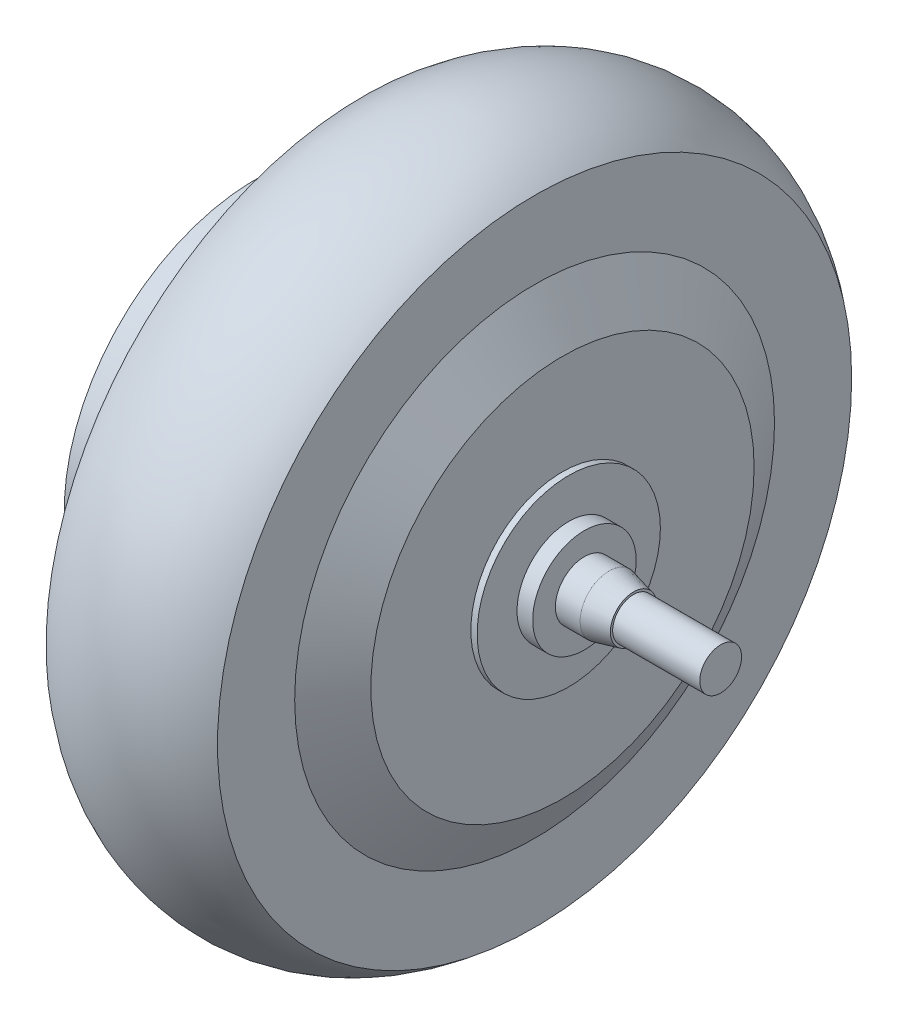
ISO-10303-21;
HEADER;
FILE_DESCRIPTION(('STEP AP214'),'2;1');
FILE_NAME('part.step','',(''),(''),'','','');
FILE_SCHEMA(('AUTOMOTIVE_DESIGN { 1 0 10303 214 1 1 1 1 }'));
ENDSEC;
DATA;
#1=APPLICATION_CONTEXT('core data for automotive mechanical design processes');
#2=APPLICATION_PROTOCOL_DEFINITION('international standard','automotive_design',2000,#1);
#3=PRODUCT_CONTEXT('',#1,'mechanical');
#4=PRODUCT('Part','Part','',(#3));
#5=PRODUCT_RELATED_PRODUCT_CATEGORY('part','',(#4));
#6=PRODUCT_DEFINITION_FORMATION('','',#4);
#7=PRODUCT_DEFINITION_CONTEXT('part definition',#1,'design');
#8=PRODUCT_DEFINITION('design','',#6,#7);
#9=PRODUCT_DEFINITION_SHAPE('','',#8);
#10=(LENGTH_UNIT() NAMED_UNIT(*) SI_UNIT(.MILLI.,.METRE.));
#11=(NAMED_UNIT(*) PLANE_ANGLE_UNIT() SI_UNIT($,.RADIAN.));
#12=(NAMED_UNIT(*) SI_UNIT($,.STERADIAN.) SOLID_ANGLE_UNIT());
#13=UNCERTAINTY_MEASURE_WITH_UNIT(LENGTH_MEASURE(1.E-05),#10,'distance_accuracy_value','');
#14=(GEOMETRIC_REPRESENTATION_CONTEXT(3) GLOBAL_UNCERTAINTY_ASSIGNED_CONTEXT((#13)) GLOBAL_UNIT_ASSIGNED_CONTEXT((#10,
#11,#12)) REPRESENTATION_CONTEXT('',''));
#15=CARTESIAN_POINT('',(0.,0.,0.));
#16=DIRECTION('',(0.,0.,1.));
#17=DIRECTION('',(1.,0.,0.));
#18=AXIS2_PLACEMENT_3D('',#15,#16,#17);
#19=CARTESIAN_POINT('',(-55.4,0.,0.));
#20=DIRECTION('',(-1.,0.,0.));
#21=DIRECTION('',(0.,0.,1.));
#22=AXIS2_PLACEMENT_3D('',#19,#20,#21);
#23=PLANE('',#22);
#24=CARTESIAN_POINT('',(-55.4,22.6274169979696,22.6274169979695));
#25=DIRECTION('',(-1.,0.,0.));
#26=DIRECTION('',(0.,0.,1.));
#27=AXIS2_PLACEMENT_3D('',#24,#25,#26);
#28=CIRCLE('',#27,6.05);
#29=CARTESIAN_POINT('',(-55.4,22.6274169979696,28.6774169979695));
#30=VERTEX_POINT('',#29);
#31=EDGE_CURVE('E107',#30,#30,#28,.T.);
#32=ORIENTED_EDGE('',*,*,#31,.F.);
#33=EDGE_LOOP('',(#32));
#34=FACE_BOUND('',#33,.T.);
#35=CARTESIAN_POINT('',(-55.4,0.,0.));
#36=DIRECTION('',(1.,0.,0.));
#37=DIRECTION('',(0.,0.,-1.));
#38=AXIS2_PLACEMENT_3D('',#35,#36,#37);
#39=CIRCLE('',#38,11.25);
#40=CARTESIAN_POINT('',(-55.4,0.,-11.25));
#41=VERTEX_POINT('',#40);
#42=EDGE_CURVE('E127',#41,#41,#39,.T.);
#43=ORIENTED_EDGE('',*,*,#42,.T.);
#44=EDGE_LOOP('',(#43));
#45=FACE_BOUND('',#44,.T.);
#46=CARTESIAN_POINT('',(-55.4,0.,0.));
#47=DIRECTION('',(1.,0.,0.));
#48=DIRECTION('',(0.,0.,-1.));
#49=AXIS2_PLACEMENT_3D('',#46,#47,#48);
#50=CIRCLE('',#49,55.);
#51=CARTESIAN_POINT('',(-55.4,0.,-55.));
#52=VERTEX_POINT('',#51);
#53=EDGE_CURVE('E130',#52,#52,#50,.T.);
#54=ORIENTED_EDGE('',*,*,#53,.F.);
#55=EDGE_LOOP('',(#54));
#56=FACE_BOUND('',#55,.T.);
#57=DIRECTION('',(0.,1.,0.));
#58=VECTOR('',#57,1.);
#59=CARTESIAN_POINT('',(-55.4,0.,27.9774169979695));
#60=LINE('',#59,#58);
#61=CARTESIAN_POINT('',(-55.4,-34.7225830020304,27.9774169979695));
#62=VERTEX_POINT('',#61);
#63=CARTESIAN_POINT('',(-55.4,-18.0225830020304,27.9774169979695));
#64=VERTEX_POINT('',#63);
#65=EDGE_CURVE('E59',#62,#64,#60,.T.);
#66=ORIENTED_EDGE('',*,*,#65,.F.);
#67=DIRECTION('',(0.,0.,1.));
#68=VECTOR('',#67,1.);
#69=CARTESIAN_POINT('',(-55.4,-34.7225830020304,0.));
#70=LINE('',#69,#68);
#71=CARTESIAN_POINT('',(-55.4,-34.7225830020304,17.2774169979695));
#72=VERTEX_POINT('',#71);
#73=EDGE_CURVE('E106',#72,#62,#70,.T.);
#74=ORIENTED_EDGE('',*,*,#73,.F.);
#75=DIRECTION('',(0.,1.,0.));
#76=VECTOR('',#75,1.);
#77=CARTESIAN_POINT('',(-55.4,0.,17.2774169979695));
#78=LINE('',#77,#76);
#79=CARTESIAN_POINT('',(-55.4,-18.0225830020304,17.2774169979695));
#80=VERTEX_POINT('',#79);
#81=EDGE_CURVE('E103',#72,#80,#78,.T.);
#82=ORIENTED_EDGE('',*,*,#81,.T.);
#83=DIRECTION('',(0.,0.,1.));
#84=VECTOR('',#83,1.);
#85=CARTESIAN_POINT('',(-55.4,-18.0225830020304,0.));
#86=LINE('',#85,#84);
#87=EDGE_CURVE('E64',#80,#64,#86,.T.);
#88=ORIENTED_EDGE('',*,*,#87,.T.);
#89=EDGE_LOOP('',(#66,#74,#82,#88));
#90=FACE_BOUND('',#89,.T.);
#91=ADVANCED_FACE('F44',(#34,#45,#56,#90),#23,.T.);
#92=CARTESIAN_POINT('',(78.,0.,0.));
#93=DIRECTION('',(-1.,0.,0.));
#94=DIRECTION('',(0.,0.,1.));
#95=AXIS2_PLACEMENT_3D('',#92,#93,#94);
#96=PLANE('',#95);
#97=CARTESIAN_POINT('',(78.,0.,0.));
#98=DIRECTION('',(1.,0.,0.));
#99=DIRECTION('',(0.,0.,-1.));
#100=AXIS2_PLACEMENT_3D('',#97,#98,#99);
#101=CIRCLE('',#100,6.00000000000005);
#102=CARTESIAN_POINT('',(78.,0.,-6.00000000000005));
#103=VERTEX_POINT('',#102);
#104=EDGE_CURVE('E11',#103,#103,#101,.T.);
#105=ORIENTED_EDGE('',*,*,#104,.T.);
#106=EDGE_LOOP('',(#105));
#107=FACE_BOUND('',#106,.T.);
#108=ADVANCED_FACE('F46',(#107),#96,.F.);
#109=CARTESIAN_POINT('',(0.,0.,0.));
#110=DIRECTION('',(1.,0.,0.));
#111=DIRECTION('',(0.,0.,-1.));
#112=AXIS2_PLACEMENT_3D('',#109,#110,#111);
#113=CYLINDRICAL_SURFACE('',#112,6.00000000000004);
#114=ORIENTED_EDGE('',*,*,#104,.F.);
#115=EDGE_LOOP('',(#114));
#116=FACE_BOUND('',#115,.T.);
#117=CARTESIAN_POINT('',(53.,0.,0.));
#118=DIRECTION('',(1.,0.,0.));
#119=DIRECTION('',(0.,0.,-1.));
#120=AXIS2_PLACEMENT_3D('',#117,#118,#119);
#121=CIRCLE('',#120,6.00000000000002);
#122=CARTESIAN_POINT('',(53.,0.,-6.00000000000002));
#123=VERTEX_POINT('',#122);
#124=EDGE_CURVE('E52',#123,#123,#121,.T.);
#125=ORIENTED_EDGE('',*,*,#124,.T.);
#126=EDGE_LOOP('',(#125));
#127=FACE_BOUND('',#126,.T.);
#128=ADVANCED_FACE('F174',(#116,#127),#113,.T.);
#129=CARTESIAN_POINT('',(53.,0.,0.));
#130=DIRECTION('',(1.,0.,0.));
#131=DIRECTION('',(0.,0.,-1.));
#132=AXIS2_PLACEMENT_3D('',#129,#130,#131);
#133=PLANE('',#132);
#134=CARTESIAN_POINT('',(53.,0.,0.));
#135=DIRECTION('',(1.,0.,0.));
#136=DIRECTION('',(0.,0.,-1.));
#137=AXIS2_PLACEMENT_3D('',#134,#135,#136);
#138=CIRCLE('',#137,6.65);
#139=CARTESIAN_POINT('',(53.,0.,-6.65));
#140=VERTEX_POINT('',#139);
#141=EDGE_CURVE('E169',#140,#140,#138,.T.);
#142=ORIENTED_EDGE('',*,*,#141,.T.);
#143=EDGE_LOOP('',(#142));
#144=FACE_BOUND('',#143,.T.);
#145=ORIENTED_EDGE('',*,*,#124,.F.);
#146=EDGE_LOOP('',(#145));
#147=FACE_BOUND('',#146,.T.);
#148=ADVANCED_FACE('F176',(#144,#147),#133,.T.);
#149=CARTESIAN_POINT('',(46.,0.,0.));
#150=DIRECTION('',(-1.,0.,0.));
#151=DIRECTION('',(0.,0.,1.));
#152=AXIS2_PLACEMENT_3D('',#149,#150,#151);
#153=CONICAL_SURFACE('',#152,8.35000000000004,0.23824475817875);
#154=ORIENTED_EDGE('',*,*,#141,.F.);
#155=EDGE_LOOP('',(#154));
#156=FACE_BOUND('',#155,.T.);
#157=CARTESIAN_POINT('',(46.,0.,0.));
#158=DIRECTION('',(1.,0.,0.));
#159=DIRECTION('',(0.,0.,-1.));
#160=AXIS2_PLACEMENT_3D('',#157,#158,#159);
#161=CIRCLE('',#160,8.35000000000004);
#162=CARTESIAN_POINT('',(46.,0.,-8.35000000000004));
#163=VERTEX_POINT('',#162);
#164=EDGE_CURVE('E166',#163,#163,#161,.T.);
#165=ORIENTED_EDGE('',*,*,#164,.T.);
#166=EDGE_LOOP('',(#165));
#167=FACE_BOUND('',#166,.T.);
#168=ADVANCED_FACE('F178',(#156,#167),#153,.T.);
#169=CARTESIAN_POINT('',(0.,0.,0.));
#170=DIRECTION('',(1.,0.,0.));
#171=DIRECTION('',(0.,0.,-1.));
#172=AXIS2_PLACEMENT_3D('',#169,#170,#171);
#173=CYLINDRICAL_SURFACE('',#172,8.35000000000003);
#174=ORIENTED_EDGE('',*,*,#164,.F.);
#175=EDGE_LOOP('',(#174));
#176=FACE_BOUND('',#175,.T.);
#177=CARTESIAN_POINT('',(38.9,0.,0.));
#178=DIRECTION('',(1.,0.,0.));
#179=DIRECTION('',(0.,0.,-1.));
#180=AXIS2_PLACEMENT_3D('',#177,#178,#179);
#181=CIRCLE('',#180,8.35000000000002);
#182=CARTESIAN_POINT('',(38.9,0.,-8.35000000000002));
#183=VERTEX_POINT('',#182);
#184=EDGE_CURVE('E163',#183,#183,#181,.T.);
#185=ORIENTED_EDGE('',*,*,#184,.T.);
#186=EDGE_LOOP('',(#185));
#187=FACE_BOUND('',#186,.T.);
#188=ADVANCED_FACE('F185',(#176,#187),#173,.T.);
#189=CARTESIAN_POINT('',(38.9,0.,0.));
#190=DIRECTION('',(-1.,0.,0.));
#191=DIRECTION('',(0.,0.,1.));
#192=AXIS2_PLACEMENT_3D('',#189,#190,#191);
#193=PLANE('',#192);
#194=ORIENTED_EDGE('',*,*,#184,.F.);
#195=EDGE_LOOP('',(#194));
#196=FACE_BOUND('',#195,.T.);
#197=CARTESIAN_POINT('',(38.9,0.,0.));
#198=DIRECTION('',(1.,0.,0.));
#199=DIRECTION('',(0.,0.,-1.));
#200=AXIS2_PLACEMENT_3D('',#197,#198,#199);
#201=CIRCLE('',#200,14.85);
#202=CARTESIAN_POINT('',(38.9,0.,-14.85));
#203=VERTEX_POINT('',#202);
#204=EDGE_CURVE('E160',#203,#203,#201,.T.);
#205=ORIENTED_EDGE('',*,*,#204,.T.);
#206=EDGE_LOOP('',(#205));
#207=FACE_BOUND('',#206,.T.);
#208=ADVANCED_FACE('F241',(#196,#207),#193,.F.);
#209=CARTESIAN_POINT('',(0.,0.,0.));
#210=DIRECTION('',(1.,0.,0.));
#211=DIRECTION('',(0.,0.,-1.));
#212=AXIS2_PLACEMENT_3D('',#209,#210,#211);
#213=CYLINDRICAL_SURFACE('',#212,14.85);
#214=ORIENTED_EDGE('',*,*,#204,.F.);
#215=EDGE_LOOP('',(#214));
#216=FACE_BOUND('',#215,.T.);
#217=CARTESIAN_POINT('',(34.4,0.,0.));
#218=DIRECTION('',(1.,0.,0.));
#219=DIRECTION('',(0.,0.,-1.));
#220=AXIS2_PLACEMENT_3D('',#217,#218,#219);
#221=CIRCLE('',#220,14.85);
#222=CARTESIAN_POINT('',(34.4,0.,-14.85));
#223=VERTEX_POINT('',#222);
#224=EDGE_CURVE('E157',#223,#223,#221,.T.);
#225=ORIENTED_EDGE('',*,*,#224,.T.);
#226=EDGE_LOOP('',(#225));
#227=FACE_BOUND('',#226,.T.);
#228=ADVANCED_FACE('F237',(#216,#227),#213,.T.);
#229=CARTESIAN_POINT('',(34.4,0.,0.));
#230=DIRECTION('',(-1.,0.,0.));
#231=DIRECTION('',(0.,0.,1.));
#232=AXIS2_PLACEMENT_3D('',#229,#230,#231);
#233=PLANE('',#232);
#234=ORIENTED_EDGE('',*,*,#224,.F.);
#235=EDGE_LOOP('',(#234));
#236=FACE_BOUND('',#235,.T.);
#237=CARTESIAN_POINT('',(34.4,0.,0.));
#238=DIRECTION('',(1.,0.,0.));
#239=DIRECTION('',(0.,0.,-1.));
#240=AXIS2_PLACEMENT_3D('',#237,#238,#239);
#241=CIRCLE('',#240,26.3);
#242=CARTESIAN_POINT('',(34.4,0.,-26.3));
#243=VERTEX_POINT('',#242);
#244=EDGE_CURVE('E154',#243,#243,#241,.T.);
#245=ORIENTED_EDGE('',*,*,#244,.T.);
#246=EDGE_LOOP('',(#245));
#247=FACE_BOUND('',#246,.T.);
#248=ADVANCED_FACE('F233',(#236,#247),#233,.F.);
#249=CARTESIAN_POINT('',(0.,0.,0.));
#250=DIRECTION('',(1.,0.,0.));
#251=DIRECTION('',(0.,0.,-1.));
#252=AXIS2_PLACEMENT_3D('',#249,#250,#251);
#253=CYLINDRICAL_SURFACE('',#252,26.3);
#254=ORIENTED_EDGE('',*,*,#244,.F.);
#255=EDGE_LOOP('',(#254));
#256=FACE_BOUND('',#255,.T.);
#257=CARTESIAN_POINT('',(32.6,0.,0.));
#258=DIRECTION('',(1.,0.,0.));
#259=DIRECTION('',(0.,0.,-1.));
#260=AXIS2_PLACEMENT_3D('',#257,#258,#259);
#261=CIRCLE('',#260,26.3);
#262=CARTESIAN_POINT('',(32.6,0.,-26.3));
#263=VERTEX_POINT('',#262);
#264=EDGE_CURVE('E151',#263,#263,#261,.T.);
#265=ORIENTED_EDGE('',*,*,#264,.T.);
#266=EDGE_LOOP('',(#265));
#267=FACE_BOUND('',#266,.T.);
#268=ADVANCED_FACE('F229',(#256,#267),#253,.T.);
#269=CARTESIAN_POINT('',(32.6,0.,0.));
#270=DIRECTION('',(1.,0.,0.));
#271=DIRECTION('',(0.,0.,-1.));
#272=AXIS2_PLACEMENT_3D('',#269,#270,#271);
#273=PLANE('',#272);
#274=CARTESIAN_POINT('',(32.6,0.,0.));
#275=DIRECTION('',(1.,0.,0.));
#276=DIRECTION('',(0.,0.,-1.));
#277=AXIS2_PLACEMENT_3D('',#274,#275,#276);
#278=CIRCLE('',#277,55.);
#279=CARTESIAN_POINT('',(32.6,0.,-55.));
#280=VERTEX_POINT('',#279);
#281=EDGE_CURVE('E148',#280,#280,#278,.T.);
#282=ORIENTED_EDGE('',*,*,#281,.T.);
#283=EDGE_LOOP('',(#282));
#284=FACE_BOUND('',#283,.T.);
#285=ORIENTED_EDGE('',*,*,#264,.F.);
#286=EDGE_LOOP('',(#285));
#287=FACE_BOUND('',#286,.T.);
#288=ADVANCED_FACE('F225',(#284,#287),#273,.T.);
#289=CARTESIAN_POINT('',(32.6,0.,0.));
#290=DIRECTION('',(-1.,0.,0.));
#291=DIRECTION('',(0.,0.,1.));
#292=AXIS2_PLACEMENT_3D('',#289,#290,#291);
#293=CONICAL_SURFACE('',#292,55.,1.0471975511966);
#294=CARTESIAN_POINT('',(24.6,0.,0.));
#295=DIRECTION('',(1.,0.,0.));
#296=DIRECTION('',(0.,0.,-1.));
#297=AXIS2_PLACEMENT_3D('',#294,#295,#296);
#298=CIRCLE('',#297,68.8564064605511);
#299=CARTESIAN_POINT('',(24.6,0.,-68.8564064605511));
#300=VERTEX_POINT('',#299);
#301=EDGE_CURVE('E145',#300,#300,#298,.T.);
#302=ORIENTED_EDGE('',*,*,#301,.T.);
#303=EDGE_LOOP('',(#302));
#304=FACE_BOUND('',#303,.T.);
#305=ORIENTED_EDGE('',*,*,#281,.F.);
#306=EDGE_LOOP('',(#305));
#307=FACE_BOUND('',#306,.T.);
#308=ADVANCED_FACE('F221',(#304,#307),#293,.T.);
#309=CARTESIAN_POINT('',(24.6,0.,0.));
#310=DIRECTION('',(1.,0.,0.));
#311=DIRECTION('',(0.,0.,-1.));
#312=AXIS2_PLACEMENT_3D('',#309,#310,#311);
#313=PLANE('',#312);
#314=CARTESIAN_POINT('',(24.6,0.,0.));
#315=DIRECTION('',(1.,0.,0.));
#316=DIRECTION('',(0.,0.,-1.));
#317=AXIS2_PLACEMENT_3D('',#314,#315,#316);
#318=CIRCLE('',#317,91.);
#319=CARTESIAN_POINT('',(24.6,0.,-91.));
#320=VERTEX_POINT('',#319);
#321=EDGE_CURVE('E142',#320,#320,#318,.T.);
#322=ORIENTED_EDGE('',*,*,#321,.T.);
#323=EDGE_LOOP('',(#322));
#324=FACE_BOUND('',#323,.T.);
#325=ORIENTED_EDGE('',*,*,#301,.F.);
#326=EDGE_LOOP('',(#325));
#327=FACE_BOUND('',#326,.T.);
#328=ADVANCED_FACE('F217',(#324,#327),#313,.T.);
#329=CARTESIAN_POINT('',(0.,0.,0.));
#330=DIRECTION('',(1.,0.,0.));
#331=DIRECTION('',(0.,0.,-1.));
#332=AXIS2_PLACEMENT_3D('',#329,#330,#331);
#333=TOROIDAL_SURFACE('',#332,61.88,38.12);
#334=CARTESIAN_POINT('',(-24.6,0.,0.));
#335=DIRECTION('',(1.,0.,0.));
#336=DIRECTION('',(0.,0.,-1.));
#337=AXIS2_PLACEMENT_3D('',#334,#335,#336);
#338=CIRCLE('',#337,91.);
#339=CARTESIAN_POINT('',(-24.6,0.,-91.));
#340=VERTEX_POINT('',#339);
#341=EDGE_CURVE('E139',#340,#340,#338,.T.);
#342=ORIENTED_EDGE('',*,*,#341,.T.);
#343=EDGE_LOOP('',(#342));
#344=FACE_BOUND('',#343,.T.);
#345=ORIENTED_EDGE('',*,*,#321,.F.);
#346=EDGE_LOOP('',(#345));
#347=FACE_BOUND('',#346,.T.);
#348=ADVANCED_FACE('F213',(#344,#347),#333,.T.);
#349=CARTESIAN_POINT('',(-24.6,0.,0.));
#350=DIRECTION('',(1.,0.,0.));
#351=DIRECTION('',(0.,0.,-1.));
#352=AXIS2_PLACEMENT_3D('',#349,#350,#351);
#353=PLANE('',#352);
#354=ORIENTED_EDGE('',*,*,#341,.F.);
#355=EDGE_LOOP('',(#354));
#356=FACE_BOUND('',#355,.T.);
#357=CARTESIAN_POINT('',(-24.6,0.,0.));
#358=DIRECTION('',(1.,0.,0.));
#359=DIRECTION('',(0.,0.,-1.));
#360=AXIS2_PLACEMENT_3D('',#357,#358,#359);
#361=CIRCLE('',#360,68.8564064605511);
#362=CARTESIAN_POINT('',(-24.6,0.,-68.8564064605511));
#363=VERTEX_POINT('',#362);
#364=EDGE_CURVE('E136',#363,#363,#361,.T.);
#365=ORIENTED_EDGE('',*,*,#364,.T.);
#366=EDGE_LOOP('',(#365));
#367=FACE_BOUND('',#366,.T.);
#368=ADVANCED_FACE('F209',(#356,#367),#353,.F.);
#369=CARTESIAN_POINT('',(-32.6,0.,0.));
#370=DIRECTION('',(1.,0.,0.));
#371=DIRECTION('',(0.,0.,-1.));
#372=AXIS2_PLACEMENT_3D('',#369,#370,#371);
#373=CONICAL_SURFACE('',#372,55.,1.0471975511966);
#374=ORIENTED_EDGE('',*,*,#364,.F.);
#375=EDGE_LOOP('',(#374));
#376=FACE_BOUND('',#375,.T.);
#377=CARTESIAN_POINT('',(-32.6,0.,0.));
#378=DIRECTION('',(1.,0.,0.));
#379=DIRECTION('',(0.,0.,-1.));
#380=AXIS2_PLACEMENT_3D('',#377,#378,#379);
#381=CIRCLE('',#380,55.);
#382=CARTESIAN_POINT('',(-32.6,0.,-55.));
#383=VERTEX_POINT('',#382);
#384=EDGE_CURVE('E133',#383,#383,#381,.T.);
#385=ORIENTED_EDGE('',*,*,#384,.T.);
#386=EDGE_LOOP('',(#385));
#387=FACE_BOUND('',#386,.T.);
#388=ADVANCED_FACE('F205',(#376,#387),#373,.T.);
#389=CARTESIAN_POINT('',(0.,0.,0.));
#390=DIRECTION('',(1.,0.,0.));
#391=DIRECTION('',(0.,0.,-1.));
#392=AXIS2_PLACEMENT_3D('',#389,#390,#391);
#393=CYLINDRICAL_SURFACE('',#392,55.);
#394=ORIENTED_EDGE('',*,*,#53,.T.);
#395=EDGE_LOOP('',(#394));
#396=FACE_BOUND('',#395,.T.);
#397=ORIENTED_EDGE('',*,*,#384,.F.);
#398=EDGE_LOOP('',(#397));
#399=FACE_BOUND('',#398,.T.);
#400=ADVANCED_FACE('F202',(#396,#399),#393,.T.);
#401=CARTESIAN_POINT('',(0.,0.,0.));
#402=DIRECTION('',(1.,0.,0.));
#403=DIRECTION('',(0.,0.,-1.));
#404=AXIS2_PLACEMENT_3D('',#401,#402,#403);
#405=CYLINDRICAL_SURFACE('',#404,11.25);
#406=CARTESIAN_POINT('',(-60.4,0.,0.));
#407=DIRECTION('',(1.,0.,0.));
#408=DIRECTION('',(0.,0.,-1.));
#409=AXIS2_PLACEMENT_3D('',#406,#407,#408);
#410=CIRCLE('',#409,11.25);
#411=CARTESIAN_POINT('',(-60.4,0.,-11.25));
#412=VERTEX_POINT('',#411);
#413=EDGE_CURVE('E124',#412,#412,#410,.T.);
#414=ORIENTED_EDGE('',*,*,#413,.T.);
#415=EDGE_LOOP('',(#414));
#416=FACE_BOUND('',#415,.T.);
#417=ORIENTED_EDGE('',*,*,#42,.F.);
#418=EDGE_LOOP('',(#417));
#419=FACE_BOUND('',#418,.T.);
#420=ADVANCED_FACE('F200',(#416,#419),#405,.T.);
#421=CARTESIAN_POINT('',(-60.4,0.,0.));
#422=DIRECTION('',(-1.,0.,0.));
#423=DIRECTION('',(0.,0.,1.));
#424=AXIS2_PLACEMENT_3D('',#421,#422,#423);
#425=PLANE('',#424);
#426=CARTESIAN_POINT('',(-60.4,0.,0.));
#427=DIRECTION('',(1.,0.,0.));
#428=DIRECTION('',(0.,0.,-1.));
#429=AXIS2_PLACEMENT_3D('',#426,#427,#428);
#430=CIRCLE('',#429,6.00000000000001);
#431=CARTESIAN_POINT('',(-60.4,0.,-6.00000000000001));
#432=VERTEX_POINT('',#431);
#433=EDGE_CURVE('E121',#432,#432,#430,.T.);
#434=ORIENTED_EDGE('',*,*,#433,.T.);
#435=EDGE_LOOP('',(#434));
#436=FACE_BOUND('',#435,.T.);
#437=ORIENTED_EDGE('',*,*,#413,.F.);
#438=EDGE_LOOP('',(#437));
#439=FACE_BOUND('',#438,.T.);
#440=ADVANCED_FACE('F304',(#436,#439),#425,.T.);
#441=CARTESIAN_POINT('',(0.,0.,0.));
#442=DIRECTION('',(1.,0.,0.));
#443=DIRECTION('',(0.,0.,-1.));
#444=AXIS2_PLACEMENT_3D('',#441,#442,#443);
#445=CYLINDRICAL_SURFACE('',#444,6.);
#446=CARTESIAN_POINT('',(-85.4,0.,0.));
#447=DIRECTION('',(1.,0.,0.));
#448=DIRECTION('',(0.,0.,-1.));
#449=AXIS2_PLACEMENT_3D('',#446,#447,#448);
#450=CIRCLE('',#449,6.);
#451=CARTESIAN_POINT('',(-85.4,0.,-6.));
#452=VERTEX_POINT('',#451);
#453=EDGE_CURVE('E117',#452,#452,#450,.T.);
#454=ORIENTED_EDGE('',*,*,#453,.T.);
#455=EDGE_LOOP('',(#454));
#456=FACE_BOUND('',#455,.T.);
#457=ORIENTED_EDGE('',*,*,#433,.F.);
#458=EDGE_LOOP('',(#457));
#459=FACE_BOUND('',#458,.T.);
#460=ADVANCED_FACE('F310',(#456,#459),#445,.T.);
#461=CARTESIAN_POINT('',(-85.4,0.,0.));
#462=DIRECTION('',(-1.,0.,0.));
#463=DIRECTION('',(0.,0.,1.));
#464=AXIS2_PLACEMENT_3D('',#461,#462,#463);
#465=PLANE('',#464);
#466=ORIENTED_EDGE('',*,*,#453,.F.);
#467=EDGE_LOOP('',(#466));
#468=FACE_BOUND('',#467,.T.);
#469=ADVANCED_FACE('F316',(#468),#465,.T.);
#470=CARTESIAN_POINT('',(-61.,22.6274169979696,22.6274169979695));
#471=DIRECTION('',(1.,0.,0.));
#472=DIRECTION('',(0.,0.,-1.));
#473=AXIS2_PLACEMENT_3D('',#470,#471,#472);
#474=CYLINDRICAL_SURFACE('',#473,6.05);
#475=CARTESIAN_POINT('',(-61.,22.6274169979696,22.6274169979695));
#476=DIRECTION('',(-1.,0.,0.));
#477=DIRECTION('',(0.,0.,1.));
#478=AXIS2_PLACEMENT_3D('',#475,#476,#477);
#479=CIRCLE('',#478,6.05);
#480=CARTESIAN_POINT('',(-61.,22.6274169979696,28.6774169979695));
#481=VERTEX_POINT('',#480);
#482=EDGE_CURVE('E110',#481,#481,#479,.T.);
#483=ORIENTED_EDGE('',*,*,#482,.F.);
#484=EDGE_LOOP('',(#483));
#485=FACE_BOUND('',#484,.T.);
#486=ORIENTED_EDGE('',*,*,#31,.T.);
#487=EDGE_LOOP('',(#486));
#488=FACE_BOUND('',#487,.T.);
#489=ADVANCED_FACE('F323',(#485,#488),#474,.T.);
#490=CARTESIAN_POINT('',(-61.,0.,0.));
#491=DIRECTION('',(-1.,0.,0.));
#492=DIRECTION('',(0.,0.,1.));
#493=AXIS2_PLACEMENT_3D('',#490,#491,#492);
#494=PLANE('',#493);
#495=ORIENTED_EDGE('',*,*,#482,.T.);
#496=EDGE_LOOP('',(#495));
#497=FACE_BOUND('',#496,.T.);
#498=ADVANCED_FACE('F330',(#497),#494,.T.);
#499=CARTESIAN_POINT('',(-69.2,-34.7225830020304,0.));
#500=DIRECTION('',(0.,1.,0.));
#501=DIRECTION('',(0.,0.,1.));
#502=AXIS2_PLACEMENT_3D('',#499,#500,#501);
#503=PLANE('',#502);
#504=ORIENTED_EDGE('',*,*,#73,.T.);
#505=DIRECTION('',(1.,0.,0.));
#506=VECTOR('',#505,1.);
#507=CARTESIAN_POINT('',(-69.2,-34.7225830020304,27.9774169979695));
#508=LINE('',#507,#506);
#509=CARTESIAN_POINT('',(-69.2,-34.7225830020304,27.9774169979695));
#510=VERTEX_POINT('',#509);
#511=EDGE_CURVE('E87',#510,#62,#508,.T.);
#512=ORIENTED_EDGE('',*,*,#511,.F.);
#513=DIRECTION('',(0.,0.,1.));
#514=VECTOR('',#513,1.);
#515=CARTESIAN_POINT('',(-69.2,-34.7225830020304,0.));
#516=LINE('',#515,#514);
#517=CARTESIAN_POINT('',(-69.2,-34.7225830020304,17.2774169979695));
#518=VERTEX_POINT('',#517);
#519=EDGE_CURVE('E94',#518,#510,#516,.T.);
#520=ORIENTED_EDGE('',*,*,#519,.F.);
#521=DIRECTION('',(1.,0.,0.));
#522=VECTOR('',#521,1.);
#523=CARTESIAN_POINT('',(-69.2,-34.7225830020304,17.2774169979695));
#524=LINE('',#523,#522);
#525=EDGE_CURVE('E572',#518,#72,#524,.T.);
#526=ORIENTED_EDGE('',*,*,#525,.T.);
#527=EDGE_LOOP('',(#504,#512,#520,#526));
#528=FACE_BOUND('',#527,.T.);
#529=ADVANCED_FACE('F105',(#528),#503,.F.);
#530=CARTESIAN_POINT('',(-69.2,0.,27.9774169979695));
#531=DIRECTION('',(0.,0.,-1.));
#532=DIRECTION('',(-1.,0.,0.));
#533=AXIS2_PLACEMENT_3D('',#530,#531,#532);
#534=PLANE('',#533);
#535=ORIENTED_EDGE('',*,*,#65,.T.);
#536=DIRECTION('',(1.,0.,0.));
#537=VECTOR('',#536,1.);
#538=CARTESIAN_POINT('',(-69.2,-18.0225830020304,27.9774169979695));
#539=LINE('',#538,#537);
#540=CARTESIAN_POINT('',(-69.2,-18.0225830020304,27.9774169979695));
#541=VERTEX_POINT('',#540);
#542=EDGE_CURVE('E89',#541,#64,#539,.T.);
#543=ORIENTED_EDGE('',*,*,#542,.F.);
#544=DIRECTION('',(0.,1.,0.));
#545=VECTOR('',#544,1.);
#546=CARTESIAN_POINT('',(-69.2,0.,27.9774169979695));
#547=LINE('',#546,#545);
#548=EDGE_CURVE('E83',#510,#541,#547,.T.);
#549=ORIENTED_EDGE('',*,*,#548,.F.);
#550=ORIENTED_EDGE('',*,*,#511,.T.);
#551=EDGE_LOOP('',(#535,#543,#549,#550));
#552=FACE_BOUND('',#551,.T.);
#553=ADVANCED_FACE('F85',(#552),#534,.F.);
#554=CARTESIAN_POINT('',(-69.2,-18.0225830020304,0.));
#555=DIRECTION('',(0.,1.,0.));
#556=DIRECTION('',(0.,0.,1.));
#557=AXIS2_PLACEMENT_3D('',#554,#555,#556);
#558=PLANE('',#557);
#559=ORIENTED_EDGE('',*,*,#87,.F.);
#560=DIRECTION('',(1.,0.,0.));
#561=VECTOR('',#560,1.);
#562=CARTESIAN_POINT('',(-69.2,-18.0225830020304,17.2774169979695));
#563=LINE('',#562,#561);
#564=CARTESIAN_POINT('',(-69.2,-18.0225830020304,17.2774169979695));
#565=VERTEX_POINT('',#564);
#566=EDGE_CURVE('E112',#565,#80,#563,.T.);
#567=ORIENTED_EDGE('',*,*,#566,.F.);
#568=DIRECTION('',(0.,0.,1.));
#569=VECTOR('',#568,1.);
#570=CARTESIAN_POINT('',(-69.2,-18.0225830020304,0.));
#571=LINE('',#570,#569);
#572=EDGE_CURVE('E93',#565,#541,#571,.T.);
#573=ORIENTED_EDGE('',*,*,#572,.T.);
#574=ORIENTED_EDGE('',*,*,#542,.T.);
#575=EDGE_LOOP('',(#559,#567,#573,#574));
#576=FACE_BOUND('',#575,.T.);
#577=ADVANCED_FACE('F348',(#576),#558,.T.);
#578=CARTESIAN_POINT('',(-69.2,0.,17.2774169979695));
#579=DIRECTION('',(0.,0.,-1.));
#580=DIRECTION('',(-1.,0.,0.));
#581=AXIS2_PLACEMENT_3D('',#578,#579,#580);
#582=PLANE('',#581);
#583=ORIENTED_EDGE('',*,*,#81,.F.);
#584=ORIENTED_EDGE('',*,*,#525,.F.);
#585=DIRECTION('',(0.,1.,0.));
#586=VECTOR('',#585,1.);
#587=CARTESIAN_POINT('',(-69.2,0.,17.2774169979695));
#588=LINE('',#587,#586);
#589=EDGE_CURVE('E100',#518,#565,#588,.T.);
#590=ORIENTED_EDGE('',*,*,#589,.T.);
#591=ORIENTED_EDGE('',*,*,#566,.T.);
#592=EDGE_LOOP('',(#583,#584,#590,#591));
#593=FACE_BOUND('',#592,.T.);
#594=ADVANCED_FACE('F354',(#593),#582,.T.);
#595=CARTESIAN_POINT('',(-69.2,0.,0.));
#596=DIRECTION('',(-1.,0.,0.));
#597=DIRECTION('',(0.,0.,1.));
#598=AXIS2_PLACEMENT_3D('',#595,#596,#597);
#599=PLANE('',#598);
#600=ORIENTED_EDGE('',*,*,#519,.T.);
#601=ORIENTED_EDGE('',*,*,#548,.T.);
#602=ORIENTED_EDGE('',*,*,#572,.F.);
#603=ORIENTED_EDGE('',*,*,#589,.F.);
#604=EDGE_LOOP('',(#600,#601,#602,#603));
#605=FACE_BOUND('',#604,.T.);
#606=ADVANCED_FACE('F98',(#605),#599,.T.);
#607=CLOSED_SHELL('',(#91,#108,#128,#148,#168,#188,#208,#228,#248,#268,#288,#308,#328,#348,#368,
#388,#400,#420,#440,#460,#469,#489,#498,#529,#553,#577,#594,#606));
#608=MANIFOLD_SOLID_BREP('B2',#607);
#609=ADVANCED_BREP_SHAPE_REPRESENTATION('',(#18,#608),#14);
#610=SHAPE_DEFINITION_REPRESENTATION(#9,#609);
ENDSEC;
END-ISO-10303-21;
